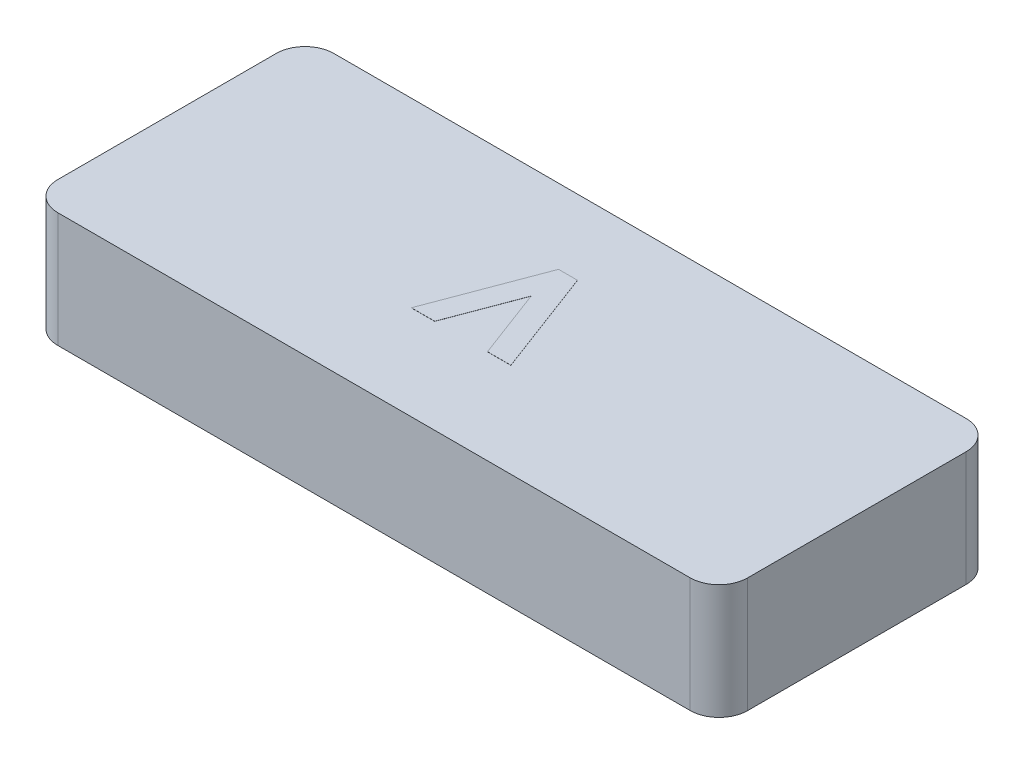
ISO-10303-21;
HEADER;
FILE_DESCRIPTION(('STEP AP214'),'2;1');
FILE_NAME('part.step','',(''),(''),'','','');
FILE_SCHEMA(('AUTOMOTIVE_DESIGN { 1 0 10303 214 1 1 1 1 }'));
ENDSEC;
DATA;
#1=APPLICATION_CONTEXT('core data for automotive mechanical design processes');
#2=APPLICATION_PROTOCOL_DEFINITION('international standard','automotive_design',2000,#1);
#3=PRODUCT_CONTEXT('',#1,'mechanical');
#4=PRODUCT('Part','Part','',(#3));
#5=PRODUCT_RELATED_PRODUCT_CATEGORY('part','',(#4));
#6=PRODUCT_DEFINITION_FORMATION('','',#4);
#7=PRODUCT_DEFINITION_CONTEXT('part definition',#1,'design');
#8=PRODUCT_DEFINITION('design','',#6,#7);
#9=PRODUCT_DEFINITION_SHAPE('','',#8);
#10=(LENGTH_UNIT() NAMED_UNIT(*) SI_UNIT(.MILLI.,.METRE.));
#11=(NAMED_UNIT(*) PLANE_ANGLE_UNIT() SI_UNIT($,.RADIAN.));
#12=(NAMED_UNIT(*) SI_UNIT($,.STERADIAN.) SOLID_ANGLE_UNIT());
#13=UNCERTAINTY_MEASURE_WITH_UNIT(LENGTH_MEASURE(1.E-05),#10,'distance_accuracy_value','');
#14=(GEOMETRIC_REPRESENTATION_CONTEXT(3) GLOBAL_UNCERTAINTY_ASSIGNED_CONTEXT((#13)) GLOBAL_UNIT_ASSIGNED_CONTEXT((#10,
#11,#12)) REPRESENTATION_CONTEXT('',''));
#15=CARTESIAN_POINT('',(0.,0.,0.));
#16=DIRECTION('',(0.,0.,1.));
#17=DIRECTION('',(1.,0.,0.));
#18=AXIS2_PLACEMENT_3D('',#15,#16,#17);
#19=CARTESIAN_POINT('',(0.,2.54,0.));
#20=DIRECTION('',(-1.,0.,0.));
#21=DIRECTION('',(0.,0.,1.));
#22=AXIS2_PLACEMENT_3D('',#19,#20,#21);
#23=PLANE('',#22);
#24=DIRECTION('',(0.,0.,-1.));
#25=VECTOR('',#24,1.);
#26=CARTESIAN_POINT('',(0.,2.54,0.));
#27=LINE('',#26,#25);
#28=CARTESIAN_POINT('',(0.,2.54,-0.635000000000001));
#29=VERTEX_POINT('',#28);
#30=CARTESIAN_POINT('',(0.,2.54,-5.461));
#31=VERTEX_POINT('',#30);
#32=EDGE_CURVE('E272',#29,#31,#27,.T.);
#33=ORIENTED_EDGE('',*,*,#32,.T.);
#34=DIRECTION('',(0.,-1.,0.));
#35=VECTOR('',#34,1.);
#36=CARTESIAN_POINT('',(0.,2.54,-5.461));
#37=LINE('',#36,#35);
#38=CARTESIAN_POINT('',(0.,0.,-5.461));
#39=VERTEX_POINT('',#38);
#40=EDGE_CURVE('E11',#31,#39,#37,.T.);
#41=ORIENTED_EDGE('',*,*,#40,.T.);
#42=DIRECTION('',(0.,0.,-1.));
#43=VECTOR('',#42,1.);
#44=CARTESIAN_POINT('',(0.,0.,0.));
#45=LINE('',#44,#43);
#46=CARTESIAN_POINT('',(0.,0.,-0.635000000000001));
#47=VERTEX_POINT('',#46);
#48=EDGE_CURVE('E242',#47,#39,#45,.T.);
#49=ORIENTED_EDGE('',*,*,#48,.F.);
#50=DIRECTION('',(0.,-1.,0.));
#51=VECTOR('',#50,1.);
#52=CARTESIAN_POINT('',(0.,2.54,-0.635000000000001));
#53=LINE('',#52,#51);
#54=EDGE_CURVE('E43',#47,#29,#53,.F.);
#55=ORIENTED_EDGE('',*,*,#54,.T.);
#56=EDGE_LOOP('',(#33,#41,#49,#55));
#57=FACE_BOUND('',#56,.T.);
#58=ADVANCED_FACE('F35',(#57),#23,.T.);
#59=CARTESIAN_POINT('',(15.24,2.54,0.));
#60=DIRECTION('',(0.,0.,1.));
#61=DIRECTION('',(1.,0.,0.));
#62=AXIS2_PLACEMENT_3D('',#59,#60,#61);
#63=PLANE('',#62);
#64=DIRECTION('',(-1.,0.,0.));
#65=VECTOR('',#64,1.);
#66=CARTESIAN_POINT('',(15.24,0.,0.));
#67=LINE('',#66,#65);
#68=CARTESIAN_POINT('',(14.605,0.,0.));
#69=VERTEX_POINT('',#68);
#70=CARTESIAN_POINT('',(0.635,0.,0.));
#71=VERTEX_POINT('',#70);
#72=EDGE_CURVE('E276',#69,#71,#67,.T.);
#73=ORIENTED_EDGE('',*,*,#72,.F.);
#74=DIRECTION('',(0.,-1.,0.));
#75=VECTOR('',#74,1.);
#76=CARTESIAN_POINT('',(14.605,2.54,0.));
#77=LINE('',#76,#75);
#78=CARTESIAN_POINT('',(14.605,2.54,0.));
#79=VERTEX_POINT('',#78);
#80=EDGE_CURVE('E322',#69,#79,#77,.F.);
#81=ORIENTED_EDGE('',*,*,#80,.T.);
#82=DIRECTION('',(-1.,0.,0.));
#83=VECTOR('',#82,1.);
#84=CARTESIAN_POINT('',(15.24,2.54,0.));
#85=LINE('',#84,#83);
#86=CARTESIAN_POINT('',(0.635,2.54,0.));
#87=VERTEX_POINT('',#86);
#88=EDGE_CURVE('E282',#79,#87,#85,.T.);
#89=ORIENTED_EDGE('',*,*,#88,.T.);
#90=DIRECTION('',(0.,-1.,0.));
#91=VECTOR('',#90,1.);
#92=CARTESIAN_POINT('',(0.635,2.54,0.));
#93=LINE('',#92,#91);
#94=EDGE_CURVE('E319',#87,#71,#93,.T.);
#95=ORIENTED_EDGE('',*,*,#94,.T.);
#96=EDGE_LOOP('',(#73,#81,#89,#95));
#97=FACE_BOUND('',#96,.T.);
#98=ADVANCED_FACE('F335',(#97),#63,.T.);
#99=CARTESIAN_POINT('',(15.24,2.54,-6.096));
#100=DIRECTION('',(1.,0.,0.));
#101=DIRECTION('',(0.,0.,-1.));
#102=AXIS2_PLACEMENT_3D('',#99,#100,#101);
#103=PLANE('',#102);
#104=DIRECTION('',(0.,0.,1.));
#105=VECTOR('',#104,1.);
#106=CARTESIAN_POINT('',(15.24,0.,-6.096));
#107=LINE('',#106,#105);
#108=CARTESIAN_POINT('',(15.24,0.,-5.461));
#109=VERTEX_POINT('',#108);
#110=CARTESIAN_POINT('',(15.24,0.,-0.634999999999998));
#111=VERTEX_POINT('',#110);
#112=EDGE_CURVE('E290',#109,#111,#107,.T.);
#113=ORIENTED_EDGE('',*,*,#112,.F.);
#114=DIRECTION('',(0.,-1.,0.));
#115=VECTOR('',#114,1.);
#116=CARTESIAN_POINT('',(15.24,2.54,-5.461));
#117=LINE('',#116,#115);
#118=CARTESIAN_POINT('',(15.24,2.54,-5.461));
#119=VERTEX_POINT('',#118);
#120=EDGE_CURVE('E310',#109,#119,#117,.F.);
#121=ORIENTED_EDGE('',*,*,#120,.T.);
#122=DIRECTION('',(0.,0.,1.));
#123=VECTOR('',#122,1.);
#124=CARTESIAN_POINT('',(15.24,2.54,-6.096));
#125=LINE('',#124,#123);
#126=CARTESIAN_POINT('',(15.24,2.54,-0.634999999999998));
#127=VERTEX_POINT('',#126);
#128=EDGE_CURVE('E279',#119,#127,#125,.T.);
#129=ORIENTED_EDGE('',*,*,#128,.T.);
#130=DIRECTION('',(0.,-1.,0.));
#131=VECTOR('',#130,1.);
#132=CARTESIAN_POINT('',(15.24,2.54,-0.634999999999998));
#133=LINE('',#132,#131);
#134=EDGE_CURVE('E307',#127,#111,#133,.T.);
#135=ORIENTED_EDGE('',*,*,#134,.T.);
#136=EDGE_LOOP('',(#113,#121,#129,#135));
#137=FACE_BOUND('',#136,.T.);
#138=ADVANCED_FACE('F345',(#137),#103,.T.);
#139=CARTESIAN_POINT('',(0.,2.54,-6.096));
#140=DIRECTION('',(0.,0.,-1.));
#141=DIRECTION('',(-1.,0.,0.));
#142=AXIS2_PLACEMENT_3D('',#139,#140,#141);
#143=PLANE('',#142);
#144=DIRECTION('',(1.,0.,0.));
#145=VECTOR('',#144,1.);
#146=CARTESIAN_POINT('',(0.,2.54,-6.096));
#147=LINE('',#146,#145);
#148=CARTESIAN_POINT('',(0.635000000000006,2.54,-6.096));
#149=VERTEX_POINT('',#148);
#150=CARTESIAN_POINT('',(14.605,2.54,-6.096));
#151=VERTEX_POINT('',#150);
#152=EDGE_CURVE('E275',#149,#151,#147,.T.);
#153=ORIENTED_EDGE('',*,*,#152,.T.);
#154=DIRECTION('',(0.,-1.,0.));
#155=VECTOR('',#154,1.);
#156=CARTESIAN_POINT('',(14.605,2.54,-6.096));
#157=LINE('',#156,#155);
#158=CARTESIAN_POINT('',(14.605,0.,-6.096));
#159=VERTEX_POINT('',#158);
#160=EDGE_CURVE('E296',#151,#159,#157,.T.);
#161=ORIENTED_EDGE('',*,*,#160,.T.);
#162=DIRECTION('',(1.,0.,0.));
#163=VECTOR('',#162,1.);
#164=CARTESIAN_POINT('',(0.,0.,-6.096));
#165=LINE('',#164,#163);
#166=CARTESIAN_POINT('',(0.635000000000006,0.,-6.096));
#167=VERTEX_POINT('',#166);
#168=EDGE_CURVE('E287',#167,#159,#165,.T.);
#169=ORIENTED_EDGE('',*,*,#168,.F.);
#170=DIRECTION('',(0.,-1.,0.));
#171=VECTOR('',#170,1.);
#172=CARTESIAN_POINT('',(0.635000000000006,2.54,-6.096));
#173=LINE('',#172,#171);
#174=EDGE_CURVE('E284',#167,#149,#173,.F.);
#175=ORIENTED_EDGE('',*,*,#174,.T.);
#176=EDGE_LOOP('',(#153,#161,#169,#175));
#177=FACE_BOUND('',#176,.T.);
#178=ADVANCED_FACE('F353',(#177),#143,.T.);
#179=CARTESIAN_POINT('',(0.,2.54,0.));
#180=DIRECTION('',(0.,-1.,0.));
#181=DIRECTION('',(0.,0.,-1.));
#182=AXIS2_PLACEMENT_3D('',#179,#180,#181);
#183=PLANE('',#182);
#184=DIRECTION('',(-1.,0.,0.));
#185=VECTOR('',#184,1.);
#186=CARTESIAN_POINT('',(6.87639362980769,2.54,-2.08410256410257));
#187=LINE('',#186,#185);
#188=CARTESIAN_POINT('',(6.87639362980769,2.54,-2.08410256410257));
#189=VERTEX_POINT('',#188);
#190=CARTESIAN_POINT('',(6.36058333333333,2.54,-2.08410256410257));
#191=VERTEX_POINT('',#190);
#192=EDGE_CURVE('E194',#189,#191,#187,.T.);
#193=ORIENTED_EDGE('',*,*,#192,.T.);
#194=DIRECTION('',(0.352890722261264,0.,-0.935664543595579));
#195=VECTOR('',#194,1.);
#196=CARTESIAN_POINT('',(6.36058333333333,2.54,-2.08410256410257));
#197=LINE('',#196,#195);
#198=CARTESIAN_POINT('',(7.25100801282051,2.54,-4.445));
#199=VERTEX_POINT('',#198);
#200=EDGE_CURVE('E211',#191,#199,#197,.T.);
#201=ORIENTED_EDGE('',*,*,#200,.T.);
#202=DIRECTION('',(1.,0.,0.));
#203=VECTOR('',#202,1.);
#204=CARTESIAN_POINT('',(7.25100801282051,2.54,-4.445));
#205=LINE('',#204,#203);
#206=CARTESIAN_POINT('',(7.66950761217949,2.54,-4.445));
#207=VERTEX_POINT('',#206);
#208=EDGE_CURVE('E173',#199,#207,#205,.T.);
#209=ORIENTED_EDGE('',*,*,#208,.T.);
#210=DIRECTION('',(0.352449255101481,0.,0.935830926278038));
#211=VECTOR('',#210,1.);
#212=CARTESIAN_POINT('',(7.66950761217949,2.54,-4.445));
#213=LINE('',#212,#211);
#214=CARTESIAN_POINT('',(8.55866025641026,2.54,-2.08410256410257));
#215=VERTEX_POINT('',#214);
#216=EDGE_CURVE('E50',#207,#215,#213,.T.);
#217=ORIENTED_EDGE('',*,*,#216,.T.);
#218=DIRECTION('',(-1.,0.,0.));
#219=VECTOR('',#218,1.);
#220=CARTESIAN_POINT('',(8.55866025641026,2.54,-2.08410256410257));
#221=LINE('',#220,#219);
#222=CARTESIAN_POINT('',(8.04221394230769,2.54,-2.08410256410257));
#223=VERTEX_POINT('',#222);
#224=EDGE_CURVE('E215',#215,#223,#221,.T.);
#225=ORIENTED_EDGE('',*,*,#224,.T.);
#226=DIRECTION('',(-0.352472496085575,0.,-0.93582217301323));
#227=VECTOR('',#226,1.);
#228=CARTESIAN_POINT('',(8.04221394230769,2.54,-2.08410256410257));
#229=LINE('',#228,#227);
#230=CARTESIAN_POINT('',(7.4596217948718,2.54,-3.63089743589744));
#231=VERTEX_POINT('',#230);
#232=EDGE_CURVE('E218',#223,#231,#229,.T.);
#233=ORIENTED_EDGE('',*,*,#232,.T.);
#234=DIRECTION('',(-0.35280941705864,0.,0.935695204238401));
#235=VECTOR('',#234,1.);
#236=CARTESIAN_POINT('',(7.4596217948718,2.54,-3.63089743589744));
#237=LINE('',#236,#235);
#238=EDGE_CURVE('E197',#231,#189,#237,.T.);
#239=ORIENTED_EDGE('',*,*,#238,.T.);
#240=EDGE_LOOP('',(#193,#201,#209,#217,#225,#233,#239));
#241=FACE_BOUND('',#240,.T.);
#242=ORIENTED_EDGE('',*,*,#128,.F.);
#243=CARTESIAN_POINT('',(14.605,2.54,-5.461));
#244=DIRECTION('',(0.,-1.,0.));
#245=DIRECTION('',(0.,0.,-1.));
#246=AXIS2_PLACEMENT_3D('',#243,#244,#245);
#247=CIRCLE('',#246,0.635);
#248=EDGE_CURVE('E317',#119,#151,#247,.F.);
#249=ORIENTED_EDGE('',*,*,#248,.T.);
#250=ORIENTED_EDGE('',*,*,#152,.F.);
#251=CARTESIAN_POINT('',(0.635000000000006,2.54,-5.461));
#252=DIRECTION('',(0.,-1.,0.));
#253=DIRECTION('',(0.,0.,-1.));
#254=AXIS2_PLACEMENT_3D('',#251,#252,#253);
#255=CIRCLE('',#254,0.635);
#256=EDGE_CURVE('E313',#149,#31,#255,.F.);
#257=ORIENTED_EDGE('',*,*,#256,.T.);
#258=ORIENTED_EDGE('',*,*,#32,.F.);
#259=CARTESIAN_POINT('',(0.635,2.54,-0.635));
#260=DIRECTION('',(0.,-1.,0.));
#261=DIRECTION('',(0.,0.,-1.));
#262=AXIS2_PLACEMENT_3D('',#259,#260,#261);
#263=CIRCLE('',#262,0.635);
#264=EDGE_CURVE('E58',#29,#87,#263,.F.);
#265=ORIENTED_EDGE('',*,*,#264,.T.);
#266=ORIENTED_EDGE('',*,*,#88,.F.);
#267=CARTESIAN_POINT('',(14.605,2.54,-0.635));
#268=DIRECTION('',(0.,-1.,0.));
#269=DIRECTION('',(0.,0.,-1.));
#270=AXIS2_PLACEMENT_3D('',#267,#268,#269);
#271=CIRCLE('',#270,0.635);
#272=EDGE_CURVE('E315',#79,#127,#271,.F.);
#273=ORIENTED_EDGE('',*,*,#272,.T.);
#274=EDGE_LOOP('',(#242,#249,#250,#257,#258,#265,#266,#273));
#275=FACE_BOUND('',#274,.T.);
#276=ADVANCED_FACE('F329',(#241,#275),#183,.F.);
#277=CARTESIAN_POINT('',(0.,0.,0.));
#278=DIRECTION('',(0.,-1.,0.));
#279=DIRECTION('',(0.,0.,-1.));
#280=AXIS2_PLACEMENT_3D('',#277,#278,#279);
#281=PLANE('',#280);
#282=DIRECTION('',(0.,0.,-1.));
#283=VECTOR('',#282,1.);
#284=CARTESIAN_POINT('',(0.635,0.,0.));
#285=LINE('',#284,#283);
#286=CARTESIAN_POINT('',(0.635000000000001,0.,-0.635));
#287=VERTEX_POINT('',#286);
#288=CARTESIAN_POINT('',(0.635000000000006,0.,-5.461));
#289=VERTEX_POINT('',#288);
#290=EDGE_CURVE('E239',#287,#289,#285,.T.);
#291=ORIENTED_EDGE('',*,*,#290,.F.);
#292=DIRECTION('',(-1.,0.,0.));
#293=VECTOR('',#292,1.);
#294=CARTESIAN_POINT('',(0.,0.,-0.635));
#295=LINE('',#294,#293);
#296=CARTESIAN_POINT('',(14.605,0.,-0.635));
#297=VERTEX_POINT('',#296);
#298=EDGE_CURVE('E248',#297,#287,#295,.T.);
#299=ORIENTED_EDGE('',*,*,#298,.F.);
#300=DIRECTION('',(0.,0.,1.));
#301=VECTOR('',#300,1.);
#302=CARTESIAN_POINT('',(14.605,0.,0.));
#303=LINE('',#302,#301);
#304=CARTESIAN_POINT('',(14.605,0.,-5.461));
#305=VERTEX_POINT('',#304);
#306=EDGE_CURVE('E268',#305,#297,#303,.T.);
#307=ORIENTED_EDGE('',*,*,#306,.F.);
#308=DIRECTION('',(1.,0.,0.));
#309=VECTOR('',#308,1.);
#310=CARTESIAN_POINT('',(0.,0.,-5.461));
#311=LINE('',#310,#309);
#312=EDGE_CURVE('E265',#289,#305,#311,.T.);
#313=ORIENTED_EDGE('',*,*,#312,.F.);
#314=EDGE_LOOP('',(#291,#299,#307,#313));
#315=FACE_BOUND('',#314,.T.);
#316=ORIENTED_EDGE('',*,*,#168,.T.);
#317=CARTESIAN_POINT('',(14.605,0.,-5.461));
#318=DIRECTION('',(0.,-1.,0.));
#319=DIRECTION('',(0.,0.,-1.));
#320=AXIS2_PLACEMENT_3D('',#317,#318,#319);
#321=CIRCLE('',#320,0.635);
#322=EDGE_CURVE('E305',#159,#109,#321,.T.);
#323=ORIENTED_EDGE('',*,*,#322,.T.);
#324=ORIENTED_EDGE('',*,*,#112,.T.);
#325=CARTESIAN_POINT('',(14.605,0.,-0.635));
#326=DIRECTION('',(0.,-1.,0.));
#327=DIRECTION('',(0.,0.,-1.));
#328=AXIS2_PLACEMENT_3D('',#325,#326,#327);
#329=CIRCLE('',#328,0.635);
#330=EDGE_CURVE('E303',#111,#69,#329,.T.);
#331=ORIENTED_EDGE('',*,*,#330,.T.);
#332=ORIENTED_EDGE('',*,*,#72,.T.);
#333=CARTESIAN_POINT('',(0.635,0.,-0.635));
#334=DIRECTION('',(0.,-1.,0.));
#335=DIRECTION('',(0.,0.,-1.));
#336=AXIS2_PLACEMENT_3D('',#333,#334,#335);
#337=CIRCLE('',#336,0.635);
#338=EDGE_CURVE('E299',#71,#47,#337,.T.);
#339=ORIENTED_EDGE('',*,*,#338,.T.);
#340=ORIENTED_EDGE('',*,*,#48,.T.);
#341=CARTESIAN_POINT('',(0.635000000000006,0.,-5.461));
#342=DIRECTION('',(0.,-1.,0.));
#343=DIRECTION('',(0.,0.,-1.));
#344=AXIS2_PLACEMENT_3D('',#341,#342,#343);
#345=CIRCLE('',#344,0.635);
#346=EDGE_CURVE('E301',#39,#167,#345,.T.);
#347=ORIENTED_EDGE('',*,*,#346,.T.);
#348=EDGE_LOOP('',(#316,#323,#324,#331,#332,#339,#340,#347));
#349=FACE_BOUND('',#348,.T.);
#350=ADVANCED_FACE('F338',(#315,#349),#281,.T.);
#351=CARTESIAN_POINT('',(0.635,2.54,0.));
#352=DIRECTION('',(-1.,0.,0.));
#353=DIRECTION('',(0.,0.,1.));
#354=AXIS2_PLACEMENT_3D('',#351,#352,#353);
#355=PLANE('',#354);
#356=ORIENTED_EDGE('',*,*,#290,.T.);
#357=DIRECTION('',(0.,-1.,0.));
#358=VECTOR('',#357,1.);
#359=CARTESIAN_POINT('',(0.635000000000006,2.54,-5.461));
#360=LINE('',#359,#358);
#361=CARTESIAN_POINT('',(0.635000000000006,1.905,-5.461));
#362=VERTEX_POINT('',#361);
#363=EDGE_CURVE('E249',#362,#289,#360,.T.);
#364=ORIENTED_EDGE('',*,*,#363,.F.);
#365=DIRECTION('',(0.,0.,-1.));
#366=VECTOR('',#365,1.);
#367=CARTESIAN_POINT('',(0.635,1.905,0.));
#368=LINE('',#367,#366);
#369=CARTESIAN_POINT('',(0.635000000000001,1.905,-0.635));
#370=VERTEX_POINT('',#369);
#371=EDGE_CURVE('E244',#370,#362,#368,.T.);
#372=ORIENTED_EDGE('',*,*,#371,.F.);
#373=DIRECTION('',(0.,-1.,0.));
#374=VECTOR('',#373,1.);
#375=CARTESIAN_POINT('',(0.635,2.54,-0.635));
#376=LINE('',#375,#374);
#377=EDGE_CURVE('E240',#370,#287,#376,.T.);
#378=ORIENTED_EDGE('',*,*,#377,.T.);
#379=EDGE_LOOP('',(#356,#364,#372,#378));
#380=FACE_BOUND('',#379,.T.);
#381=ADVANCED_FACE('F395',(#380),#355,.F.);
#382=CARTESIAN_POINT('',(15.24,2.54,-0.635));
#383=DIRECTION('',(0.,0.,1.));
#384=DIRECTION('',(1.,0.,0.));
#385=AXIS2_PLACEMENT_3D('',#382,#383,#384);
#386=PLANE('',#385);
#387=ORIENTED_EDGE('',*,*,#298,.T.);
#388=ORIENTED_EDGE('',*,*,#377,.F.);
#389=DIRECTION('',(-1.,0.,0.));
#390=VECTOR('',#389,1.);
#391=CARTESIAN_POINT('',(0.,1.905,-0.635));
#392=LINE('',#391,#390);
#393=CARTESIAN_POINT('',(14.605,1.905,-0.635));
#394=VERTEX_POINT('',#393);
#395=EDGE_CURVE('E252',#394,#370,#392,.T.);
#396=ORIENTED_EDGE('',*,*,#395,.F.);
#397=DIRECTION('',(0.,-1.,0.));
#398=VECTOR('',#397,1.);
#399=CARTESIAN_POINT('',(14.605,2.54,-0.635));
#400=LINE('',#399,#398);
#401=EDGE_CURVE('E243',#394,#297,#400,.T.);
#402=ORIENTED_EDGE('',*,*,#401,.T.);
#403=EDGE_LOOP('',(#387,#388,#396,#402));
#404=FACE_BOUND('',#403,.T.);
#405=ADVANCED_FACE('F421',(#404),#386,.F.);
#406=CARTESIAN_POINT('',(14.605,2.54,-6.096));
#407=DIRECTION('',(1.,0.,0.));
#408=DIRECTION('',(0.,0.,-1.));
#409=AXIS2_PLACEMENT_3D('',#406,#407,#408);
#410=PLANE('',#409);
#411=ORIENTED_EDGE('',*,*,#306,.T.);
#412=ORIENTED_EDGE('',*,*,#401,.F.);
#413=DIRECTION('',(0.,0.,1.));
#414=VECTOR('',#413,1.);
#415=CARTESIAN_POINT('',(14.605,1.905,0.));
#416=LINE('',#415,#414);
#417=CARTESIAN_POINT('',(14.605,1.905,-5.461));
#418=VERTEX_POINT('',#417);
#419=EDGE_CURVE('E257',#418,#394,#416,.T.);
#420=ORIENTED_EDGE('',*,*,#419,.F.);
#421=DIRECTION('',(0.,-1.,0.));
#422=VECTOR('',#421,1.);
#423=CARTESIAN_POINT('',(14.605,2.54,-5.461));
#424=LINE('',#423,#422);
#425=EDGE_CURVE('E251',#418,#305,#424,.T.);
#426=ORIENTED_EDGE('',*,*,#425,.T.);
#427=EDGE_LOOP('',(#411,#412,#420,#426));
#428=FACE_BOUND('',#427,.T.);
#429=ADVANCED_FACE('F384',(#428),#410,.F.);
#430=CARTESIAN_POINT('',(0.,2.54,-5.461));
#431=DIRECTION('',(0.,0.,-1.));
#432=DIRECTION('',(-1.,0.,0.));
#433=AXIS2_PLACEMENT_3D('',#430,#431,#432);
#434=PLANE('',#433);
#435=ORIENTED_EDGE('',*,*,#312,.T.);
#436=ORIENTED_EDGE('',*,*,#425,.F.);
#437=DIRECTION('',(1.,0.,0.));
#438=VECTOR('',#437,1.);
#439=CARTESIAN_POINT('',(0.,1.905,-5.461));
#440=LINE('',#439,#438);
#441=EDGE_CURVE('E247',#362,#418,#440,.T.);
#442=ORIENTED_EDGE('',*,*,#441,.F.);
#443=ORIENTED_EDGE('',*,*,#363,.T.);
#444=EDGE_LOOP('',(#435,#436,#442,#443));
#445=FACE_BOUND('',#444,.T.);
#446=ADVANCED_FACE('F378',(#445),#434,.F.);
#447=CARTESIAN_POINT('',(0.,1.905,0.));
#448=DIRECTION('',(0.,-1.,0.));
#449=DIRECTION('',(0.,0.,-1.));
#450=AXIS2_PLACEMENT_3D('',#447,#448,#449);
#451=PLANE('',#450);
#452=CARTESIAN_POINT('',(7.62,1.905,-3.048));
#453=DIRECTION('',(0.,-1.,0.));
#454=DIRECTION('',(0.,0.,-1.));
#455=AXIS2_PLACEMENT_3D('',#452,#453,#454);
#456=CIRCLE('',#455,1.5875);
#457=CARTESIAN_POINT('',(7.62,1.905,-4.6355));
#458=VERTEX_POINT('',#457);
#459=EDGE_CURVE('E224',#458,#458,#456,.T.);
#460=ORIENTED_EDGE('',*,*,#459,.F.);
#461=EDGE_LOOP('',(#460));
#462=FACE_BOUND('',#461,.T.);
#463=ORIENTED_EDGE('',*,*,#371,.T.);
#464=ORIENTED_EDGE('',*,*,#441,.T.);
#465=ORIENTED_EDGE('',*,*,#419,.T.);
#466=ORIENTED_EDGE('',*,*,#395,.T.);
#467=EDGE_LOOP('',(#463,#464,#465,#466));
#468=FACE_BOUND('',#467,.T.);
#469=ADVANCED_FACE('F374',(#462,#468),#451,.T.);
#470=CARTESIAN_POINT('',(14.605,2.54,-5.461));
#471=DIRECTION('',(0.,-1.,0.));
#472=DIRECTION('',(0.,0.,-1.));
#473=AXIS2_PLACEMENT_3D('',#470,#471,#472);
#474=CYLINDRICAL_SURFACE('',#473,0.635);
#475=ORIENTED_EDGE('',*,*,#248,.F.);
#476=ORIENTED_EDGE('',*,*,#120,.F.);
#477=ORIENTED_EDGE('',*,*,#322,.F.);
#478=ORIENTED_EDGE('',*,*,#160,.F.);
#479=EDGE_LOOP('',(#475,#476,#477,#478));
#480=FACE_BOUND('',#479,.T.);
#481=ADVANCED_FACE('F350',(#480),#474,.T.);
#482=CARTESIAN_POINT('',(14.605,2.54,-0.635));
#483=DIRECTION('',(0.,-1.,0.));
#484=DIRECTION('',(0.,0.,-1.));
#485=AXIS2_PLACEMENT_3D('',#482,#483,#484);
#486=CYLINDRICAL_SURFACE('',#485,0.635);
#487=ORIENTED_EDGE('',*,*,#272,.F.);
#488=ORIENTED_EDGE('',*,*,#80,.F.);
#489=ORIENTED_EDGE('',*,*,#330,.F.);
#490=ORIENTED_EDGE('',*,*,#134,.F.);
#491=EDGE_LOOP('',(#487,#488,#489,#490));
#492=FACE_BOUND('',#491,.T.);
#493=ADVANCED_FACE('F343',(#492),#486,.T.);
#494=CARTESIAN_POINT('',(0.635000000000006,2.54,-5.461));
#495=DIRECTION('',(0.,-1.,0.));
#496=DIRECTION('',(0.,0.,-1.));
#497=AXIS2_PLACEMENT_3D('',#494,#495,#496);
#498=CYLINDRICAL_SURFACE('',#497,0.635);
#499=ORIENTED_EDGE('',*,*,#256,.F.);
#500=ORIENTED_EDGE('',*,*,#174,.F.);
#501=ORIENTED_EDGE('',*,*,#346,.F.);
#502=ORIENTED_EDGE('',*,*,#40,.F.);
#503=EDGE_LOOP('',(#499,#500,#501,#502));
#504=FACE_BOUND('',#503,.T.);
#505=ADVANCED_FACE('F356',(#504),#498,.T.);
#506=CARTESIAN_POINT('',(0.635,2.54,-0.635));
#507=DIRECTION('',(0.,-1.,0.));
#508=DIRECTION('',(0.,0.,-1.));
#509=AXIS2_PLACEMENT_3D('',#506,#507,#508);
#510=CYLINDRICAL_SURFACE('',#509,0.635);
#511=ORIENTED_EDGE('',*,*,#264,.F.);
#512=ORIENTED_EDGE('',*,*,#54,.F.);
#513=ORIENTED_EDGE('',*,*,#338,.F.);
#514=ORIENTED_EDGE('',*,*,#94,.F.);
#515=EDGE_LOOP('',(#511,#512,#513,#514));
#516=FACE_BOUND('',#515,.T.);
#517=ADVANCED_FACE('F37',(#516),#510,.T.);
#518=CARTESIAN_POINT('',(7.62,-4.49012806053458,-3.048));
#519=DIRECTION('',(0.,1.,0.));
#520=DIRECTION('',(0.,0.,1.));
#521=AXIS2_PLACEMENT_3D('',#518,#519,#520);
#522=CYLINDRICAL_SURFACE('',#521,1.5875);
#523=ORIENTED_EDGE('',*,*,#459,.T.);
#524=EDGE_LOOP('',(#523));
#525=FACE_BOUND('',#524,.T.);
#526=CARTESIAN_POINT('',(7.62,0.,-3.048));
#527=DIRECTION('',(0.,-1.,0.));
#528=DIRECTION('',(0.,0.,-1.));
#529=AXIS2_PLACEMENT_3D('',#526,#527,#528);
#530=CIRCLE('',#529,1.5875);
#531=CARTESIAN_POINT('',(7.62,0.,-4.6355));
#532=VERTEX_POINT('',#531);
#533=EDGE_CURVE('E236',#532,#532,#530,.T.);
#534=ORIENTED_EDGE('',*,*,#533,.F.);
#535=EDGE_LOOP('',(#534));
#536=FACE_BOUND('',#535,.T.);
#537=ADVANCED_FACE('F362',(#525,#536),#522,.T.);
#538=CARTESIAN_POINT('',(0.,0.,0.));
#539=DIRECTION('',(0.,-1.,0.));
#540=DIRECTION('',(0.,0.,-1.));
#541=AXIS2_PLACEMENT_3D('',#538,#539,#540);
#542=PLANE('',#541);
#543=ORIENTED_EDGE('',*,*,#533,.T.);
#544=EDGE_LOOP('',(#543));
#545=FACE_BOUND('',#544,.T.);
#546=ADVANCED_FACE('F490',(#545),#542,.T.);
#547=CARTESIAN_POINT('',(6.36058333333333,2.54254,-2.08410256410257));
#548=DIRECTION('',(-0.935664543595579,0.,-0.352890722261264));
#549=DIRECTION('',(-0.352890722261264,0.,0.935664543595579));
#550=AXIS2_PLACEMENT_3D('',#547,#548,#549);
#551=PLANE('',#550);
#552=ORIENTED_EDGE('',*,*,#200,.F.);
#553=DIRECTION('',(0.,-1.,0.));
#554=VECTOR('',#553,1.);
#555=CARTESIAN_POINT('',(6.36058333333333,2.54254,-2.08410256410257));
#556=LINE('',#555,#554);
#557=CARTESIAN_POINT('',(6.36058333333333,2.54254,-2.08410256410257));
#558=VERTEX_POINT('',#557);
#559=EDGE_CURVE('E193',#558,#191,#556,.T.);
#560=ORIENTED_EDGE('',*,*,#559,.F.);
#561=DIRECTION('',(0.352890722261264,0.,-0.935664543595579));
#562=VECTOR('',#561,1.);
#563=CARTESIAN_POINT('',(6.36058333333333,2.54254,-2.08410256410257));
#564=LINE('',#563,#562);
#565=CARTESIAN_POINT('',(7.25100801282051,2.54254,-4.445));
#566=VERTEX_POINT('',#565);
#567=EDGE_CURVE('E186',#558,#566,#564,.T.);
#568=ORIENTED_EDGE('',*,*,#567,.T.);
#569=DIRECTION('',(0.,-1.,0.));
#570=VECTOR('',#569,1.);
#571=CARTESIAN_POINT('',(7.25100801282051,2.54254,-4.445));
#572=LINE('',#571,#570);
#573=EDGE_CURVE('E168',#566,#199,#572,.T.);
#574=ORIENTED_EDGE('',*,*,#573,.T.);
#575=EDGE_LOOP('',(#552,#560,#568,#574));
#576=FACE_BOUND('',#575,.T.);
#577=ADVANCED_FACE('F192',(#576),#551,.T.);
#578=CARTESIAN_POINT('',(6.87639362980769,2.54254,-2.08410256410257));
#579=DIRECTION('',(0.,0.,1.));
#580=DIRECTION('',(1.,0.,0.));
#581=AXIS2_PLACEMENT_3D('',#578,#579,#580);
#582=PLANE('',#581);
#583=ORIENTED_EDGE('',*,*,#192,.F.);
#584=DIRECTION('',(0.,-1.,0.));
#585=VECTOR('',#584,1.);
#586=CARTESIAN_POINT('',(6.87639362980769,2.54254,-2.08410256410257));
#587=LINE('',#586,#585);
#588=CARTESIAN_POINT('',(6.87639362980769,2.54254,-2.08410256410257));
#589=VERTEX_POINT('',#588);
#590=EDGE_CURVE('E225',#589,#189,#587,.T.);
#591=ORIENTED_EDGE('',*,*,#590,.F.);
#592=DIRECTION('',(-1.,0.,0.));
#593=VECTOR('',#592,1.);
#594=CARTESIAN_POINT('',(6.87639362980769,2.54254,-2.08410256410257));
#595=LINE('',#594,#593);
#596=EDGE_CURVE('E179',#589,#558,#595,.T.);
#597=ORIENTED_EDGE('',*,*,#596,.T.);
#598=ORIENTED_EDGE('',*,*,#559,.T.);
#599=EDGE_LOOP('',(#583,#591,#597,#598));
#600=FACE_BOUND('',#599,.T.);
#601=ADVANCED_FACE('F505',(#600),#582,.T.);
#602=CARTESIAN_POINT('',(7.4596217948718,2.54254,-3.63089743589744));
#603=DIRECTION('',(0.935695204238401,0.,0.35280941705864));
#604=DIRECTION('',(0.35280941705864,0.,-0.935695204238401));
#605=AXIS2_PLACEMENT_3D('',#602,#603,#604);
#606=PLANE('',#605);
#607=ORIENTED_EDGE('',*,*,#238,.F.);
#608=DIRECTION('',(0.,-1.,0.));
#609=VECTOR('',#608,1.);
#610=CARTESIAN_POINT('',(7.4596217948718,2.54254,-3.63089743589744));
#611=LINE('',#610,#609);
#612=CARTESIAN_POINT('',(7.4596217948718,2.54254,-3.63089743589744));
#613=VERTEX_POINT('',#612);
#614=EDGE_CURVE('E227',#613,#231,#611,.T.);
#615=ORIENTED_EDGE('',*,*,#614,.F.);
#616=DIRECTION('',(-0.35280941705864,0.,0.935695204238401));
#617=VECTOR('',#616,1.);
#618=CARTESIAN_POINT('',(7.4596217948718,2.54254,-3.63089743589744));
#619=LINE('',#618,#617);
#620=EDGE_CURVE('E207',#613,#589,#619,.T.);
#621=ORIENTED_EDGE('',*,*,#620,.T.);
#622=ORIENTED_EDGE('',*,*,#590,.T.);
#623=EDGE_LOOP('',(#607,#615,#621,#622));
#624=FACE_BOUND('',#623,.T.);
#625=ADVANCED_FACE('F513',(#624),#606,.T.);
#626=CARTESIAN_POINT('',(8.04221394230769,2.54254,-2.08410256410257));
#627=DIRECTION('',(-0.93582217301323,0.,0.352472496085575));
#628=DIRECTION('',(0.352472496085575,0.,0.93582217301323));
#629=AXIS2_PLACEMENT_3D('',#626,#627,#628);
#630=PLANE('',#629);
#631=ORIENTED_EDGE('',*,*,#232,.F.);
#632=DIRECTION('',(0.,-1.,0.));
#633=VECTOR('',#632,1.);
#634=CARTESIAN_POINT('',(8.04221394230769,2.54254,-2.08410256410257));
#635=LINE('',#634,#633);
#636=CARTESIAN_POINT('',(8.04221394230769,2.54254,-2.08410256410257));
#637=VERTEX_POINT('',#636);
#638=EDGE_CURVE('E229',#637,#223,#635,.T.);
#639=ORIENTED_EDGE('',*,*,#638,.F.);
#640=DIRECTION('',(-0.352472496085575,0.,-0.93582217301323));
#641=VECTOR('',#640,1.);
#642=CARTESIAN_POINT('',(8.04221394230769,2.54254,-2.08410256410257));
#643=LINE('',#642,#641);
#644=EDGE_CURVE('E204',#637,#613,#643,.T.);
#645=ORIENTED_EDGE('',*,*,#644,.T.);
#646=ORIENTED_EDGE('',*,*,#614,.T.);
#647=EDGE_LOOP('',(#631,#639,#645,#646));
#648=FACE_BOUND('',#647,.T.);
#649=ADVANCED_FACE('F522',(#648),#630,.T.);
#650=CARTESIAN_POINT('',(8.55866025641026,2.54254,-2.08410256410257));
#651=DIRECTION('',(0.,0.,1.));
#652=DIRECTION('',(1.,0.,0.));
#653=AXIS2_PLACEMENT_3D('',#650,#651,#652);
#654=PLANE('',#653);
#655=ORIENTED_EDGE('',*,*,#224,.F.);
#656=DIRECTION('',(0.,-1.,0.));
#657=VECTOR('',#656,1.);
#658=CARTESIAN_POINT('',(8.55866025641026,2.54254,-2.08410256410257));
#659=LINE('',#658,#657);
#660=CARTESIAN_POINT('',(8.55866025641026,2.54254,-2.08410256410257));
#661=VERTEX_POINT('',#660);
#662=EDGE_CURVE('E231',#661,#215,#659,.T.);
#663=ORIENTED_EDGE('',*,*,#662,.F.);
#664=DIRECTION('',(-1.,0.,0.));
#665=VECTOR('',#664,1.);
#666=CARTESIAN_POINT('',(8.55866025641026,2.54254,-2.08410256410257));
#667=LINE('',#666,#665);
#668=EDGE_CURVE('E201',#661,#637,#667,.T.);
#669=ORIENTED_EDGE('',*,*,#668,.T.);
#670=ORIENTED_EDGE('',*,*,#638,.T.);
#671=EDGE_LOOP('',(#655,#663,#669,#670));
#672=FACE_BOUND('',#671,.T.);
#673=ADVANCED_FACE('F531',(#672),#654,.T.);
#674=CARTESIAN_POINT('',(7.66950761217949,2.54254,-4.445));
#675=DIRECTION('',(0.935830926278038,0.,-0.352449255101481));
#676=DIRECTION('',(-0.352449255101481,0.,-0.935830926278038));
#677=AXIS2_PLACEMENT_3D('',#674,#675,#676);
#678=PLANE('',#677);
#679=ORIENTED_EDGE('',*,*,#216,.F.);
#680=DIRECTION('',(0.,-1.,0.));
#681=VECTOR('',#680,1.);
#682=CARTESIAN_POINT('',(7.66950761217949,2.54254,-4.445));
#683=LINE('',#682,#681);
#684=CARTESIAN_POINT('',(7.66950761217949,2.54254,-4.445));
#685=VERTEX_POINT('',#684);
#686=EDGE_CURVE('E178',#685,#207,#683,.T.);
#687=ORIENTED_EDGE('',*,*,#686,.F.);
#688=DIRECTION('',(0.352449255101481,0.,0.935830926278038));
#689=VECTOR('',#688,1.);
#690=CARTESIAN_POINT('',(7.66950761217949,2.54254,-4.445));
#691=LINE('',#690,#689);
#692=EDGE_CURVE('E190',#685,#661,#691,.T.);
#693=ORIENTED_EDGE('',*,*,#692,.T.);
#694=ORIENTED_EDGE('',*,*,#662,.T.);
#695=EDGE_LOOP('',(#679,#687,#693,#694));
#696=FACE_BOUND('',#695,.T.);
#697=ADVANCED_FACE('F540',(#696),#678,.T.);
#698=CARTESIAN_POINT('',(7.25100801282051,2.54254,-4.445));
#699=DIRECTION('',(0.,0.,-1.));
#700=DIRECTION('',(-1.,0.,0.));
#701=AXIS2_PLACEMENT_3D('',#698,#699,#700);
#702=PLANE('',#701);
#703=ORIENTED_EDGE('',*,*,#208,.F.);
#704=ORIENTED_EDGE('',*,*,#573,.F.);
#705=DIRECTION('',(1.,0.,0.));
#706=VECTOR('',#705,1.);
#707=CARTESIAN_POINT('',(7.25100801282051,2.54254,-4.445));
#708=LINE('',#707,#706);
#709=EDGE_CURVE('E171',#566,#685,#708,.T.);
#710=ORIENTED_EDGE('',*,*,#709,.T.);
#711=ORIENTED_EDGE('',*,*,#686,.T.);
#712=EDGE_LOOP('',(#703,#704,#710,#711));
#713=FACE_BOUND('',#712,.T.);
#714=ADVANCED_FACE('F170',(#713),#702,.T.);
#715=CARTESIAN_POINT('',(0.,2.54254,0.));
#716=DIRECTION('',(0.,-1.,0.));
#717=DIRECTION('',(0.,0.,-1.));
#718=AXIS2_PLACEMENT_3D('',#715,#716,#717);
#719=PLANE('',#718);
#720=ORIENTED_EDGE('',*,*,#567,.F.);
#721=ORIENTED_EDGE('',*,*,#596,.F.);
#722=ORIENTED_EDGE('',*,*,#620,.F.);
#723=ORIENTED_EDGE('',*,*,#644,.F.);
#724=ORIENTED_EDGE('',*,*,#668,.F.);
#725=ORIENTED_EDGE('',*,*,#692,.F.);
#726=ORIENTED_EDGE('',*,*,#709,.F.);
#727=EDGE_LOOP('',(#720,#721,#722,#723,#724,#725,#726));
#728=FACE_BOUND('',#727,.T.);
#729=ADVANCED_FACE('F184',(#728),#719,.F.);
#730=CLOSED_SHELL('',(#58,#98,#138,#178,#276,#350,#381,#405,#429,#446,#469,#481,#493,#505,#517,
#537,#546,#577,#601,#625,#649,#673,#697,#714,#729));
#731=MANIFOLD_SOLID_BREP('B2',#730);
#732=ADVANCED_BREP_SHAPE_REPRESENTATION('',(#18,#731),#14);
#733=SHAPE_DEFINITION_REPRESENTATION(#9,#732);
ENDSEC;
END-ISO-10303-21;
